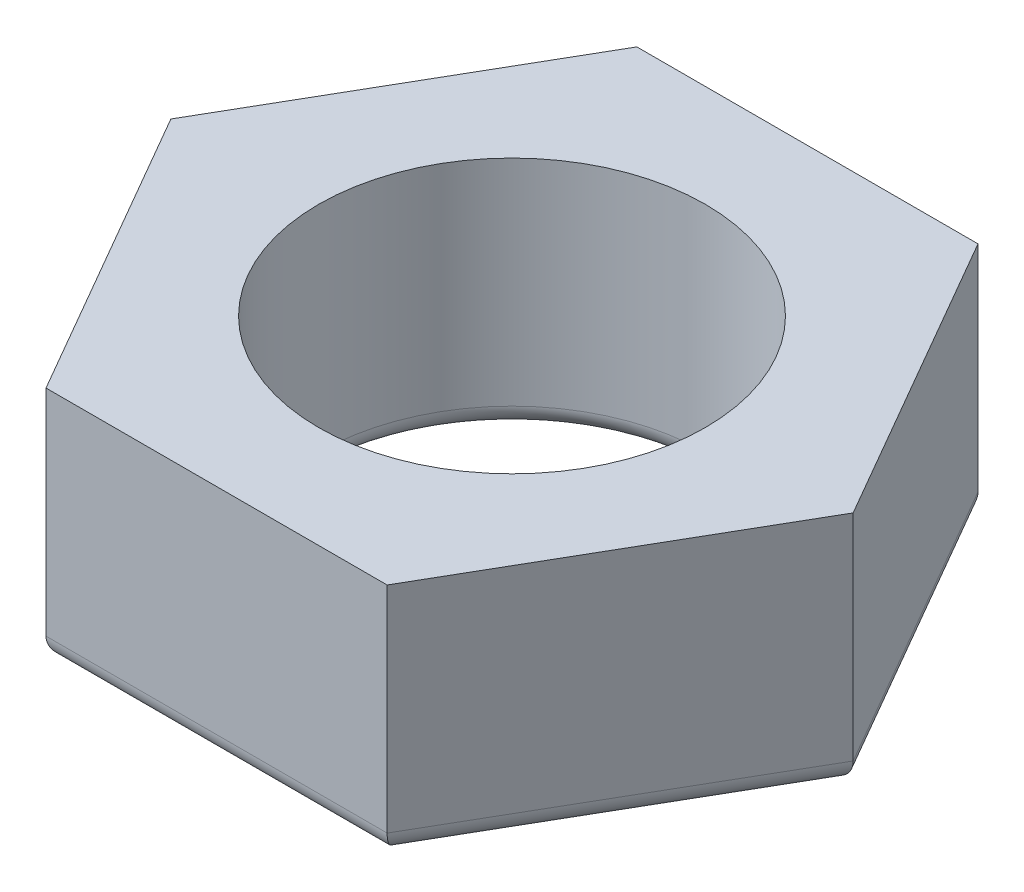
ISO-10303-21;
HEADER;
FILE_DESCRIPTION(('STEP AP214'),'2;1');
FILE_NAME('part.step','',(''),(''),'','','');
FILE_SCHEMA(('AUTOMOTIVE_DESIGN { 1 0 10303 214 1 1 1 1 }'));
ENDSEC;
DATA;
#1=APPLICATION_CONTEXT('core data for automotive mechanical design processes');
#2=APPLICATION_PROTOCOL_DEFINITION('international standard','automotive_design',2000,#1);
#3=PRODUCT_CONTEXT('',#1,'mechanical');
#4=PRODUCT('Part','Part','',(#3));
#5=PRODUCT_RELATED_PRODUCT_CATEGORY('part','',(#4));
#6=PRODUCT_DEFINITION_FORMATION('','',#4);
#7=PRODUCT_DEFINITION_CONTEXT('part definition',#1,'design');
#8=PRODUCT_DEFINITION('design','',#6,#7);
#9=PRODUCT_DEFINITION_SHAPE('','',#8);
#10=(LENGTH_UNIT() NAMED_UNIT(*) SI_UNIT(.MILLI.,.METRE.));
#11=(NAMED_UNIT(*) PLANE_ANGLE_UNIT() SI_UNIT($,.RADIAN.));
#12=(NAMED_UNIT(*) SI_UNIT($,.STERADIAN.) SOLID_ANGLE_UNIT());
#13=UNCERTAINTY_MEASURE_WITH_UNIT(LENGTH_MEASURE(1.E-05),#10,'distance_accuracy_value','');
#14=(GEOMETRIC_REPRESENTATION_CONTEXT(3) GLOBAL_UNCERTAINTY_ASSIGNED_CONTEXT((#13)) GLOBAL_UNIT_ASSIGNED_CONTEXT((#10,
#11,#12)) REPRESENTATION_CONTEXT('',''));
#15=CARTESIAN_POINT('',(0.,0.,0.));
#16=DIRECTION('',(0.,0.,1.));
#17=DIRECTION('',(1.,0.,0.));
#18=AXIS2_PLACEMENT_3D('',#15,#16,#17);
#19=CARTESIAN_POINT('',(3.17542648054294,2.2,0.));
#20=DIRECTION('',(-0.866025403784438,0.,0.5));
#21=DIRECTION('',(0.5,0.,0.866025403784439));
#22=AXIS2_PLACEMENT_3D('',#19,#20,#21);
#23=PLANE('',#22);
#24=DIRECTION('',(0.,-1.,0.));
#25=VECTOR('',#24,1.);
#26=CARTESIAN_POINT('',(3.17542648054294,2.2,0.));
#27=LINE('',#26,#25);
#28=CARTESIAN_POINT('',(3.17542648054294,2.2,0.));
#29=VERTEX_POINT('',#28);
#30=CARTESIAN_POINT('',(3.17542648054294,0.2,0.));
#31=VERTEX_POINT('',#30);
#32=EDGE_CURVE('E225',#29,#31,#27,.T.);
#33=ORIENTED_EDGE('',*,*,#32,.T.);
#34=DIRECTION('',(-0.5,0.,-0.866025403784439));
#35=VECTOR('',#34,1.);
#36=CARTESIAN_POINT('',(3.17542648054294,0.2,0.));
#37=LINE('',#36,#35);
#38=CARTESIAN_POINT('',(1.58771324027147,0.2,-2.75));
#39=VERTEX_POINT('',#38);
#40=EDGE_CURVE('E48',#31,#39,#37,.T.);
#41=ORIENTED_EDGE('',*,*,#40,.T.);
#42=DIRECTION('',(0.,-1.,0.));
#43=VECTOR('',#42,1.);
#44=CARTESIAN_POINT('',(1.58771324027147,2.2,-2.75));
#45=LINE('',#44,#43);
#46=CARTESIAN_POINT('',(1.58771324027147,2.2,-2.75));
#47=VERTEX_POINT('',#46);
#48=EDGE_CURVE('E120',#47,#39,#45,.T.);
#49=ORIENTED_EDGE('',*,*,#48,.F.);
#50=DIRECTION('',(-0.5,0.,-0.866025403784438));
#51=VECTOR('',#50,1.);
#52=CARTESIAN_POINT('',(3.17542648054294,2.2,0.));
#53=LINE('',#52,#51);
#54=EDGE_CURVE('E128',#29,#47,#53,.T.);
#55=ORIENTED_EDGE('',*,*,#54,.F.);
#56=EDGE_LOOP('',(#33,#41,#49,#55));
#57=FACE_BOUND('',#56,.T.);
#58=ADVANCED_FACE('F38',(#57),#23,.F.);
#59=CARTESIAN_POINT('',(1.58771324027147,2.2,-2.75));
#60=DIRECTION('',(0.,0.,1.));
#61=DIRECTION('',(1.,0.,0.));
#62=AXIS2_PLACEMENT_3D('',#59,#60,#61);
#63=PLANE('',#62);
#64=ORIENTED_EDGE('',*,*,#48,.T.);
#65=DIRECTION('',(-1.,0.,0.));
#66=VECTOR('',#65,1.);
#67=CARTESIAN_POINT('',(1.58771324027147,0.2,-2.75));
#68=LINE('',#67,#66);
#69=CARTESIAN_POINT('',(-1.58771324027147,0.2,-2.75));
#70=VERTEX_POINT('',#69);
#71=EDGE_CURVE('E140',#39,#70,#68,.T.);
#72=ORIENTED_EDGE('',*,*,#71,.T.);
#73=DIRECTION('',(0.,-1.,0.));
#74=VECTOR('',#73,1.);
#75=CARTESIAN_POINT('',(-1.58771324027147,2.2,-2.75));
#76=LINE('',#75,#74);
#77=CARTESIAN_POINT('',(-1.58771324027147,2.2,-2.75));
#78=VERTEX_POINT('',#77);
#79=EDGE_CURVE('E123',#78,#70,#76,.T.);
#80=ORIENTED_EDGE('',*,*,#79,.F.);
#81=DIRECTION('',(-1.,0.,0.));
#82=VECTOR('',#81,1.);
#83=CARTESIAN_POINT('',(1.58771324027147,2.2,-2.75));
#84=LINE('',#83,#82);
#85=EDGE_CURVE('E115',#47,#78,#84,.T.);
#86=ORIENTED_EDGE('',*,*,#85,.F.);
#87=EDGE_LOOP('',(#64,#72,#80,#86));
#88=FACE_BOUND('',#87,.T.);
#89=ADVANCED_FACE('F117',(#88),#63,.F.);
#90=CARTESIAN_POINT('',(-1.58771324027147,2.2,-2.75));
#91=DIRECTION('',(0.866025403784439,0.,0.5));
#92=DIRECTION('',(0.5,0.,-0.866025403784439));
#93=AXIS2_PLACEMENT_3D('',#90,#91,#92);
#94=PLANE('',#93);
#95=ORIENTED_EDGE('',*,*,#79,.T.);
#96=DIRECTION('',(-0.5,0.,0.866025403784439));
#97=VECTOR('',#96,1.);
#98=CARTESIAN_POINT('',(-1.58771324027147,0.2,-2.75));
#99=LINE('',#98,#97);
#100=CARTESIAN_POINT('',(-3.17542648054294,0.2,0.));
#101=VERTEX_POINT('',#100);
#102=EDGE_CURVE('E172',#70,#101,#99,.T.);
#103=ORIENTED_EDGE('',*,*,#102,.T.);
#104=DIRECTION('',(0.,-1.,0.));
#105=VECTOR('',#104,1.);
#106=CARTESIAN_POINT('',(-3.17542648054294,2.2,0.));
#107=LINE('',#106,#105);
#108=CARTESIAN_POINT('',(-3.17542648054294,2.2,0.));
#109=VERTEX_POINT('',#108);
#110=EDGE_CURVE('E146',#109,#101,#107,.T.);
#111=ORIENTED_EDGE('',*,*,#110,.F.);
#112=DIRECTION('',(-0.5,0.,0.866025403784439));
#113=VECTOR('',#112,1.);
#114=CARTESIAN_POINT('',(-1.58771324027147,2.2,-2.75));
#115=LINE('',#114,#113);
#116=EDGE_CURVE('E127',#78,#109,#115,.T.);
#117=ORIENTED_EDGE('',*,*,#116,.F.);
#118=EDGE_LOOP('',(#95,#103,#111,#117));
#119=FACE_BOUND('',#118,.T.);
#120=ADVANCED_FACE('F276',(#119),#94,.F.);
#121=CARTESIAN_POINT('',(-3.17542648054294,2.2,0.));
#122=DIRECTION('',(0.866025403784439,0.,-0.5));
#123=DIRECTION('',(-0.5,0.,-0.866025403784439));
#124=AXIS2_PLACEMENT_3D('',#121,#122,#123);
#125=PLANE('',#124);
#126=ORIENTED_EDGE('',*,*,#110,.T.);
#127=DIRECTION('',(0.5,0.,0.866025403784439));
#128=VECTOR('',#127,1.);
#129=CARTESIAN_POINT('',(-3.17542648054294,0.2,0.));
#130=LINE('',#129,#128);
#131=CARTESIAN_POINT('',(-1.58771324027147,0.2,2.75));
#132=VERTEX_POINT('',#131);
#133=EDGE_CURVE('E175',#101,#132,#130,.T.);
#134=ORIENTED_EDGE('',*,*,#133,.T.);
#135=DIRECTION('',(0.,-1.,0.));
#136=VECTOR('',#135,1.);
#137=CARTESIAN_POINT('',(-1.58771324027147,2.2,2.75));
#138=LINE('',#137,#136);
#139=CARTESIAN_POINT('',(-1.58771324027147,2.2,2.75));
#140=VERTEX_POINT('',#139);
#141=EDGE_CURVE('E231',#140,#132,#138,.T.);
#142=ORIENTED_EDGE('',*,*,#141,.F.);
#143=DIRECTION('',(0.5,0.,0.866025403784439));
#144=VECTOR('',#143,1.);
#145=CARTESIAN_POINT('',(-3.17542648054294,2.2,0.));
#146=LINE('',#145,#144);
#147=EDGE_CURVE('E217',#109,#140,#146,.T.);
#148=ORIENTED_EDGE('',*,*,#147,.F.);
#149=EDGE_LOOP('',(#126,#134,#142,#148));
#150=FACE_BOUND('',#149,.T.);
#151=ADVANCED_FACE('F238',(#150),#125,.F.);
#152=CARTESIAN_POINT('',(-1.58771324027147,2.2,2.75));
#153=DIRECTION('',(0.,0.,-1.));
#154=DIRECTION('',(-1.,0.,0.));
#155=AXIS2_PLACEMENT_3D('',#152,#153,#154);
#156=PLANE('',#155);
#157=ORIENTED_EDGE('',*,*,#141,.T.);
#158=DIRECTION('',(1.,0.,0.));
#159=VECTOR('',#158,1.);
#160=CARTESIAN_POINT('',(-1.58771324027147,0.2,2.75));
#161=LINE('',#160,#159);
#162=CARTESIAN_POINT('',(1.58771324027147,0.2,2.75));
#163=VERTEX_POINT('',#162);
#164=EDGE_CURVE('E64',#132,#163,#161,.T.);
#165=ORIENTED_EDGE('',*,*,#164,.T.);
#166=DIRECTION('',(0.,-1.,0.));
#167=VECTOR('',#166,1.);
#168=CARTESIAN_POINT('',(1.58771324027147,2.2,2.75));
#169=LINE('',#168,#167);
#170=CARTESIAN_POINT('',(1.58771324027147,2.2,2.75));
#171=VERTEX_POINT('',#170);
#172=EDGE_CURVE('E228',#171,#163,#169,.T.);
#173=ORIENTED_EDGE('',*,*,#172,.F.);
#174=DIRECTION('',(1.,0.,0.));
#175=VECTOR('',#174,1.);
#176=CARTESIAN_POINT('',(-1.58771324027147,2.2,2.75));
#177=LINE('',#176,#175);
#178=EDGE_CURVE('E220',#140,#171,#177,.T.);
#179=ORIENTED_EDGE('',*,*,#178,.F.);
#180=EDGE_LOOP('',(#157,#165,#173,#179));
#181=FACE_BOUND('',#180,.T.);
#182=ADVANCED_FACE('F356',(#181),#156,.F.);
#183=CARTESIAN_POINT('',(1.58771324027147,2.2,2.75));
#184=DIRECTION('',(-0.866025403784438,0.,-0.5));
#185=DIRECTION('',(-0.5,0.,0.866025403784439));
#186=AXIS2_PLACEMENT_3D('',#183,#184,#185);
#187=PLANE('',#186);
#188=ORIENTED_EDGE('',*,*,#172,.T.);
#189=DIRECTION('',(0.5,0.,-0.866025403784439));
#190=VECTOR('',#189,1.);
#191=CARTESIAN_POINT('',(1.58771324027147,0.2,2.75));
#192=LINE('',#191,#190);
#193=EDGE_CURVE('E56',#163,#31,#192,.T.);
#194=ORIENTED_EDGE('',*,*,#193,.T.);
#195=ORIENTED_EDGE('',*,*,#32,.F.);
#196=DIRECTION('',(0.5,0.,-0.866025403784439));
#197=VECTOR('',#196,1.);
#198=CARTESIAN_POINT('',(1.58771324027147,2.2,2.75));
#199=LINE('',#198,#197);
#200=EDGE_CURVE('E133',#171,#29,#199,.T.);
#201=ORIENTED_EDGE('',*,*,#200,.F.);
#202=EDGE_LOOP('',(#188,#194,#195,#201));
#203=FACE_BOUND('',#202,.T.);
#204=ADVANCED_FACE('F348',(#203),#187,.F.);
#205=CARTESIAN_POINT('',(0.,2.2,0.));
#206=DIRECTION('',(0.,1.,0.));
#207=DIRECTION('',(0.,0.,1.));
#208=AXIS2_PLACEMENT_3D('',#205,#206,#207);
#209=PLANE('',#208);
#210=CARTESIAN_POINT('',(0.,2.2,0.));
#211=DIRECTION('',(0.,1.,0.));
#212=DIRECTION('',(0.,0.,1.));
#213=AXIS2_PLACEMENT_3D('',#210,#211,#212);
#214=CIRCLE('',#213,1.8);
#215=CARTESIAN_POINT('',(0.,2.2,1.8));
#216=VERTEX_POINT('',#215);
#217=EDGE_CURVE('E136',#216,#216,#214,.T.);
#218=ORIENTED_EDGE('',*,*,#217,.F.);
#219=EDGE_LOOP('',(#218));
#220=FACE_BOUND('',#219,.T.);
#221=ORIENTED_EDGE('',*,*,#54,.T.);
#222=ORIENTED_EDGE('',*,*,#85,.T.);
#223=ORIENTED_EDGE('',*,*,#116,.T.);
#224=ORIENTED_EDGE('',*,*,#147,.T.);
#225=ORIENTED_EDGE('',*,*,#178,.T.);
#226=ORIENTED_EDGE('',*,*,#200,.T.);
#227=EDGE_LOOP('',(#221,#222,#223,#224,#225,#226));
#228=FACE_BOUND('',#227,.T.);
#229=ADVANCED_FACE('F131',(#220,#228),#209,.T.);
#230=CARTESIAN_POINT('',(0.,0.,0.));
#231=DIRECTION('',(0.,1.,0.));
#232=DIRECTION('',(0.,0.,1.));
#233=AXIS2_PLACEMENT_3D('',#230,#231,#232);
#234=PLANE('',#233);
#235=DIRECTION('',(-0.5,0.,0.866025403784439));
#236=VECTOR('',#235,1.);
#237=CARTESIAN_POINT('',(-2.20836477965032,0.,-1.275));
#238=LINE('',#237,#236);
#239=CARTESIAN_POINT('',(-2.94448637286709,0.,0.));
#240=VERTEX_POINT('',#239);
#241=CARTESIAN_POINT('',(-1.47224318643355,0.,-2.55));
#242=VERTEX_POINT('',#241);
#243=EDGE_CURVE('E165',#240,#242,#238,.F.);
#244=ORIENTED_EDGE('',*,*,#243,.T.);
#245=DIRECTION('',(-1.,0.,0.));
#246=VECTOR('',#245,1.);
#247=CARTESIAN_POINT('',(0.,0.,-2.55));
#248=LINE('',#247,#246);
#249=CARTESIAN_POINT('',(1.47224318643355,0.,-2.55));
#250=VERTEX_POINT('',#249);
#251=EDGE_CURVE('E168',#242,#250,#248,.F.);
#252=ORIENTED_EDGE('',*,*,#251,.T.);
#253=DIRECTION('',(-0.5,0.,-0.866025403784439));
#254=VECTOR('',#253,1.);
#255=CARTESIAN_POINT('',(2.20836477965032,0.,-1.275));
#256=LINE('',#255,#254);
#257=CARTESIAN_POINT('',(2.94448637286709,0.,0.));
#258=VERTEX_POINT('',#257);
#259=EDGE_CURVE('E153',#250,#258,#256,.F.);
#260=ORIENTED_EDGE('',*,*,#259,.T.);
#261=DIRECTION('',(0.5,0.,-0.866025403784439));
#262=VECTOR('',#261,1.);
#263=CARTESIAN_POINT('',(2.20836477965032,0.,1.275));
#264=LINE('',#263,#262);
#265=CARTESIAN_POINT('',(1.47224318643355,0.,2.55));
#266=VERTEX_POINT('',#265);
#267=EDGE_CURVE('E156',#258,#266,#264,.F.);
#268=ORIENTED_EDGE('',*,*,#267,.T.);
#269=DIRECTION('',(1.,0.,0.));
#270=VECTOR('',#269,1.);
#271=CARTESIAN_POINT('',(0.,0.,2.55));
#272=LINE('',#271,#270);
#273=CARTESIAN_POINT('',(-1.47224318643355,0.,2.55));
#274=VERTEX_POINT('',#273);
#275=EDGE_CURVE('E159',#266,#274,#272,.F.);
#276=ORIENTED_EDGE('',*,*,#275,.T.);
#277=DIRECTION('',(0.5,0.,0.866025403784439));
#278=VECTOR('',#277,1.);
#279=CARTESIAN_POINT('',(-2.20836477965032,0.,1.275));
#280=LINE('',#279,#278);
#281=EDGE_CURVE('E162',#274,#240,#280,.F.);
#282=ORIENTED_EDGE('',*,*,#281,.T.);
#283=EDGE_LOOP('',(#244,#252,#260,#268,#276,#282));
#284=FACE_BOUND('',#283,.T.);
#285=CARTESIAN_POINT('',(0.,0.,0.));
#286=DIRECTION('',(0.,1.,0.));
#287=DIRECTION('',(0.,0.,1.));
#288=AXIS2_PLACEMENT_3D('',#285,#286,#287);
#289=CIRCLE('',#288,2.);
#290=CARTESIAN_POINT('',(0.,0.,2.));
#291=VERTEX_POINT('',#290);
#292=EDGE_CURVE('E144',#291,#291,#289,.T.);
#293=ORIENTED_EDGE('',*,*,#292,.T.);
#294=EDGE_LOOP('',(#293));
#295=FACE_BOUND('',#294,.T.);
#296=ADVANCED_FACE('F250',(#284,#295),#234,.F.);
#297=CARTESIAN_POINT('',(0.,2.2,0.));
#298=DIRECTION('',(0.,1.,0.));
#299=DIRECTION('',(0.,0.,1.));
#300=AXIS2_PLACEMENT_3D('',#297,#298,#299);
#301=CYLINDRICAL_SURFACE('',#300,1.8);
#302=CARTESIAN_POINT('',(0.,0.2,0.));
#303=DIRECTION('',(0.,1.,0.));
#304=DIRECTION('',(0.,0.,1.));
#305=AXIS2_PLACEMENT_3D('',#302,#303,#304);
#306=CIRCLE('',#305,1.8);
#307=CARTESIAN_POINT('',(0.,0.2,1.8));
#308=VERTEX_POINT('',#307);
#309=EDGE_CURVE('E11',#308,#308,#306,.F.);
#310=ORIENTED_EDGE('',*,*,#309,.T.);
#311=EDGE_LOOP('',(#310));
#312=FACE_BOUND('',#311,.T.);
#313=ORIENTED_EDGE('',*,*,#217,.T.);
#314=EDGE_LOOP('',(#313));
#315=FACE_BOUND('',#314,.T.);
#316=ADVANCED_FACE('F269',(#312,#315),#301,.F.);
#317=CARTESIAN_POINT('',(-1.58771324027147,0.2,2.55));
#318=DIRECTION('',(1.,0.,0.));
#319=DIRECTION('',(0.,0.,-1.));
#320=AXIS2_PLACEMENT_3D('',#317,#318,#319);
#321=CYLINDRICAL_SURFACE('',#320,0.2);
#322=CARTESIAN_POINT('',(-1.47224318643355,0.2,2.55));
#323=DIRECTION('',(0.866025403784439,0.,0.5));
#324=DIRECTION('',(0.5,0.,-0.866025403784439));
#325=AXIS2_PLACEMENT_3D('',#322,#323,#324);
#326=ELLIPSE('',#325,0.23094010767585,0.2);
#327=EDGE_CURVE('E197',#274,#132,#326,.F.);
#328=ORIENTED_EDGE('',*,*,#327,.F.);
#329=ORIENTED_EDGE('',*,*,#275,.F.);
#330=CARTESIAN_POINT('',(1.47224318643355,0.2,2.55));
#331=DIRECTION('',(0.866025403784439,0.,-0.5));
#332=DIRECTION('',(-0.5,0.,-0.866025403784439));
#333=AXIS2_PLACEMENT_3D('',#330,#331,#332);
#334=ELLIPSE('',#333,0.23094010767585,0.2);
#335=EDGE_CURVE('E42',#163,#266,#334,.T.);
#336=ORIENTED_EDGE('',*,*,#335,.F.);
#337=ORIENTED_EDGE('',*,*,#164,.F.);
#338=EDGE_LOOP('',(#328,#329,#336,#337));
#339=FACE_BOUND('',#338,.T.);
#340=ADVANCED_FACE('F262',(#339),#321,.T.);
#341=CARTESIAN_POINT('',(1.41450815951458,0.2,2.65));
#342=DIRECTION('',(0.5,0.,-0.866025403784439));
#343=DIRECTION('',(-0.866025403784438,0.,-0.5));
#344=AXIS2_PLACEMENT_3D('',#341,#342,#343);
#345=CYLINDRICAL_SURFACE('',#344,0.2);
#346=ORIENTED_EDGE('',*,*,#335,.T.);
#347=ORIENTED_EDGE('',*,*,#267,.F.);
#348=CARTESIAN_POINT('',(2.94448637286709,0.2,0.));
#349=DIRECTION('',(0.,0.,-1.));
#350=DIRECTION('',(-1.,0.,0.));
#351=AXIS2_PLACEMENT_3D('',#348,#349,#350);
#352=ELLIPSE('',#351,0.23094010767585,0.2);
#353=EDGE_CURVE('E194',#31,#258,#352,.T.);
#354=ORIENTED_EDGE('',*,*,#353,.F.);
#355=ORIENTED_EDGE('',*,*,#193,.F.);
#356=EDGE_LOOP('',(#346,#347,#354,#355));
#357=FACE_BOUND('',#356,.T.);
#358=ADVANCED_FACE('F260',(#357),#345,.T.);
#359=CARTESIAN_POINT('',(-3.00222139978605,0.2,-0.1));
#360=DIRECTION('',(0.5,0.,0.866025403784439));
#361=DIRECTION('',(0.866025403784439,0.,-0.5));
#362=AXIS2_PLACEMENT_3D('',#359,#360,#361);
#363=CYLINDRICAL_SURFACE('',#362,0.2);
#364=ORIENTED_EDGE('',*,*,#327,.T.);
#365=ORIENTED_EDGE('',*,*,#133,.F.);
#366=CARTESIAN_POINT('',(-2.94448637286709,0.2,0.));
#367=DIRECTION('',(0.,0.,1.));
#368=DIRECTION('',(1.,0.,0.));
#369=AXIS2_PLACEMENT_3D('',#366,#367,#368);
#370=ELLIPSE('',#369,0.23094010767585,0.2);
#371=EDGE_CURVE('E190',#240,#101,#370,.F.);
#372=ORIENTED_EDGE('',*,*,#371,.F.);
#373=ORIENTED_EDGE('',*,*,#281,.F.);
#374=EDGE_LOOP('',(#364,#365,#372,#373));
#375=FACE_BOUND('',#374,.T.);
#376=ADVANCED_FACE('F242',(#375),#363,.T.);
#377=CARTESIAN_POINT('',(3.00222139978605,0.2,0.0999999999999997));
#378=DIRECTION('',(-0.5,0.,-0.866025403784439));
#379=DIRECTION('',(-0.866025403784438,0.,0.5));
#380=AXIS2_PLACEMENT_3D('',#377,#378,#379);
#381=CYLINDRICAL_SURFACE('',#380,0.2);
#382=ORIENTED_EDGE('',*,*,#353,.T.);
#383=ORIENTED_EDGE('',*,*,#259,.F.);
#384=CARTESIAN_POINT('',(1.47224318643355,0.2,-2.55));
#385=DIRECTION('',(-0.866025403784439,0.,-0.5));
#386=DIRECTION('',(0.5,0.,-0.866025403784439));
#387=AXIS2_PLACEMENT_3D('',#384,#385,#386);
#388=ELLIPSE('',#387,0.23094010767585,0.2);
#389=EDGE_CURVE('E187',#39,#250,#388,.T.);
#390=ORIENTED_EDGE('',*,*,#389,.F.);
#391=ORIENTED_EDGE('',*,*,#40,.F.);
#392=EDGE_LOOP('',(#382,#383,#390,#391));
#393=FACE_BOUND('',#392,.T.);
#394=ADVANCED_FACE('F257',(#393),#381,.T.);
#395=CARTESIAN_POINT('',(-1.41450815951458,0.2,-2.65));
#396=DIRECTION('',(-0.5,0.,0.866025403784439));
#397=DIRECTION('',(0.866025403784439,0.,0.5));
#398=AXIS2_PLACEMENT_3D('',#395,#396,#397);
#399=CYLINDRICAL_SURFACE('',#398,0.2);
#400=ORIENTED_EDGE('',*,*,#371,.T.);
#401=ORIENTED_EDGE('',*,*,#102,.F.);
#402=CARTESIAN_POINT('',(-1.47224318643355,0.2,-2.55));
#403=DIRECTION('',(-0.866025403784439,0.,0.5));
#404=DIRECTION('',(0.5,0.,0.866025403784439));
#405=AXIS2_PLACEMENT_3D('',#402,#403,#404);
#406=ELLIPSE('',#405,0.23094010767585,0.2);
#407=EDGE_CURVE('E184',#242,#70,#406,.F.);
#408=ORIENTED_EDGE('',*,*,#407,.F.);
#409=ORIENTED_EDGE('',*,*,#243,.F.);
#410=EDGE_LOOP('',(#400,#401,#408,#409));
#411=FACE_BOUND('',#410,.T.);
#412=ADVANCED_FACE('F246',(#411),#399,.T.);
#413=CARTESIAN_POINT('',(1.58771324027147,0.2,-2.55));
#414=DIRECTION('',(-1.,0.,0.));
#415=DIRECTION('',(0.,0.,1.));
#416=AXIS2_PLACEMENT_3D('',#413,#414,#415);
#417=CYLINDRICAL_SURFACE('',#416,0.2);
#418=ORIENTED_EDGE('',*,*,#389,.T.);
#419=ORIENTED_EDGE('',*,*,#251,.F.);
#420=ORIENTED_EDGE('',*,*,#407,.T.);
#421=ORIENTED_EDGE('',*,*,#71,.F.);
#422=EDGE_LOOP('',(#418,#419,#420,#421));
#423=FACE_BOUND('',#422,.T.);
#424=ADVANCED_FACE('F253',(#423),#417,.T.);
#425=CARTESIAN_POINT('',(0.,0.2,0.));
#426=DIRECTION('',(0.,1.,0.));
#427=DIRECTION('',(0.,0.,1.));
#428=AXIS2_PLACEMENT_3D('',#425,#426,#427);
#429=TOROIDAL_SURFACE('',#428,2.,0.2);
#430=ORIENTED_EDGE('',*,*,#292,.F.);
#431=EDGE_LOOP('',(#430));
#432=FACE_BOUND('',#431,.T.);
#433=ORIENTED_EDGE('',*,*,#309,.F.);
#434=EDGE_LOOP('',(#433));
#435=FACE_BOUND('',#434,.T.);
#436=ADVANCED_FACE('F40',(#432,#435),#429,.T.);
#437=CLOSED_SHELL('',(#58,#89,#120,#151,#182,#204,#229,#296,#316,#340,#358,#376,#394,#412,#424,#436));
#438=MANIFOLD_SOLID_BREP('B2',#437);
#439=ADVANCED_BREP_SHAPE_REPRESENTATION('',(#18,#438),#14);
#440=SHAPE_DEFINITION_REPRESENTATION(#9,#439);
ENDSEC;
END-ISO-10303-21;
